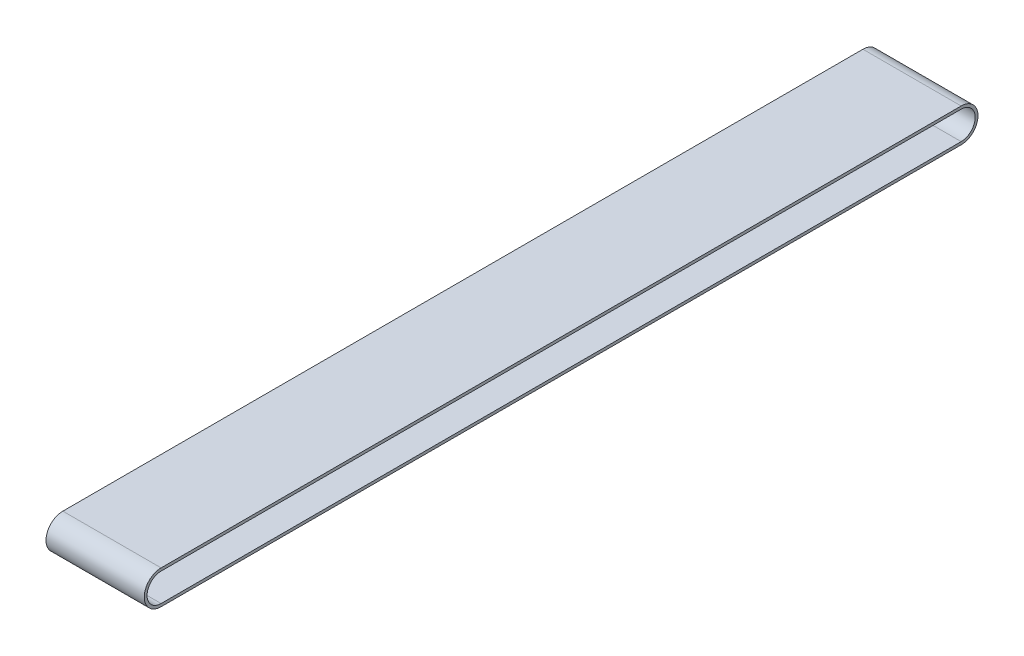
ISO-10303-21;
HEADER;
FILE_DESCRIPTION(('STEP AP214'),'2;1');
FILE_NAME('part.step','',(''),(''),'','','');
FILE_SCHEMA(('AUTOMOTIVE_DESIGN { 1 0 10303 214 1 1 1 1 }'));
ENDSEC;
DATA;
#1=APPLICATION_CONTEXT('core data for automotive mechanical design processes');
#2=APPLICATION_PROTOCOL_DEFINITION('international standard','automotive_design',2000,#1);
#3=PRODUCT_CONTEXT('',#1,'mechanical');
#4=PRODUCT('Part','Part','',(#3));
#5=PRODUCT_RELATED_PRODUCT_CATEGORY('part','',(#4));
#6=PRODUCT_DEFINITION_FORMATION('','',#4);
#7=PRODUCT_DEFINITION_CONTEXT('part definition',#1,'design');
#8=PRODUCT_DEFINITION('design','',#6,#7);
#9=PRODUCT_DEFINITION_SHAPE('','',#8);
#10=(LENGTH_UNIT() NAMED_UNIT(*) SI_UNIT(.MILLI.,.METRE.));
#11=(NAMED_UNIT(*) PLANE_ANGLE_UNIT() SI_UNIT($,.RADIAN.));
#12=(NAMED_UNIT(*) SI_UNIT($,.STERADIAN.) SOLID_ANGLE_UNIT());
#13=UNCERTAINTY_MEASURE_WITH_UNIT(LENGTH_MEASURE(1.E-05),#10,'distance_accuracy_value','');
#14=(GEOMETRIC_REPRESENTATION_CONTEXT(3) GLOBAL_UNCERTAINTY_ASSIGNED_CONTEXT((#13)) GLOBAL_UNIT_ASSIGNED_CONTEXT((#10,
#11,#12)) REPRESENTATION_CONTEXT('',''));
#15=CARTESIAN_POINT('',(0.,0.,0.));
#16=DIRECTION('',(0.,0.,1.));
#17=DIRECTION('',(1.,0.,0.));
#18=AXIS2_PLACEMENT_3D('',#15,#16,#17);
#19=CARTESIAN_POINT('',(350.,0.,0.));
#20=DIRECTION('',(1.,0.,0.));
#21=DIRECTION('',(0.,0.,-1.));
#22=AXIS2_PLACEMENT_3D('',#19,#20,#21);
#23=PLANE('',#22);
#24=CARTESIAN_POINT('',(350.,0.,0.));
#25=DIRECTION('',(1.,0.,0.));
#26=DIRECTION('',(0.,0.,-1.));
#27=AXIS2_PLACEMENT_3D('',#24,#25,#26);
#28=CIRCLE('',#27,59.9999999999998);
#29=CARTESIAN_POINT('',(350.,60.,0.));
#30=VERTEX_POINT('',#29);
#31=CARTESIAN_POINT('',(350.,-59.9999999999996,-3.86409654273834E-13));
#32=VERTEX_POINT('',#31);
#33=EDGE_CURVE('E153',#30,#32,#28,.T.);
#34=ORIENTED_EDGE('',*,*,#33,.T.);
#35=DIRECTION('',(0.,0.,-1.));
#36=VECTOR('',#35,1.);
#37=CARTESIAN_POINT('',(350.,-60.,-2850.));
#38=LINE('',#37,#36);
#39=CARTESIAN_POINT('',(350.,-60.,-2850.));
#40=VERTEX_POINT('',#39);
#41=EDGE_CURVE('E157',#32,#40,#38,.T.);
#42=ORIENTED_EDGE('',*,*,#41,.T.);
#43=CARTESIAN_POINT('',(350.,0.,-2850.));
#44=DIRECTION('',(1.,0.,0.));
#45=DIRECTION('',(0.,0.,-1.));
#46=AXIS2_PLACEMENT_3D('',#43,#44,#45);
#47=CIRCLE('',#46,60.);
#48=CARTESIAN_POINT('',(350.,60.,-2850.));
#49=VERTEX_POINT('',#48);
#50=EDGE_CURVE('E161',#40,#49,#47,.T.);
#51=ORIENTED_EDGE('',*,*,#50,.T.);
#52=DIRECTION('',(0.,0.,1.));
#53=VECTOR('',#52,1.);
#54=CARTESIAN_POINT('',(350.,60.,0.));
#55=LINE('',#54,#53);
#56=EDGE_CURVE('E164',#49,#30,#55,.T.);
#57=ORIENTED_EDGE('',*,*,#56,.T.);
#58=EDGE_LOOP('',(#34,#42,#51,#57));
#59=FACE_BOUND('',#58,.T.);
#60=DIRECTION('',(0.,0.,-1.));
#61=VECTOR('',#60,1.);
#62=CARTESIAN_POINT('',(350.,-49.9999999999998,-2850.));
#63=LINE('',#62,#61);
#64=CARTESIAN_POINT('',(350.,-49.9999999999998,3.5527136788005E-12));
#65=VERTEX_POINT('',#64);
#66=CARTESIAN_POINT('',(350.,-49.9999999999999,-2850.));
#67=VERTEX_POINT('',#66);
#68=EDGE_CURVE('E114',#65,#67,#63,.T.);
#69=ORIENTED_EDGE('',*,*,#68,.F.);
#70=CARTESIAN_POINT('',(350.,0.,0.));
#71=DIRECTION('',(1.,0.,0.));
#72=DIRECTION('',(0.,0.,-1.));
#73=AXIS2_PLACEMENT_3D('',#70,#71,#72);
#74=CIRCLE('',#73,49.9999999999999);
#75=CARTESIAN_POINT('',(350.,50.,0.));
#76=VERTEX_POINT('',#75);
#77=EDGE_CURVE('E105',#76,#65,#74,.T.);
#78=ORIENTED_EDGE('',*,*,#77,.F.);
#79=DIRECTION('',(0.,0.,1.));
#80=VECTOR('',#79,1.);
#81=CARTESIAN_POINT('',(350.,50.,0.));
#82=LINE('',#81,#80);
#83=CARTESIAN_POINT('',(350.,50.,-2850.));
#84=VERTEX_POINT('',#83);
#85=EDGE_CURVE('E131',#84,#76,#82,.T.);
#86=ORIENTED_EDGE('',*,*,#85,.F.);
#87=CARTESIAN_POINT('',(350.,0.,-2850.));
#88=DIRECTION('',(1.,0.,0.));
#89=DIRECTION('',(0.,0.,1.));
#90=AXIS2_PLACEMENT_3D('',#87,#88,#89);
#91=CIRCLE('',#90,49.9999999999999);
#92=EDGE_CURVE('E127',#67,#84,#91,.T.);
#93=ORIENTED_EDGE('',*,*,#92,.F.);
#94=EDGE_LOOP('',(#69,#78,#86,#93));
#95=FACE_BOUND('',#94,.T.);
#96=ADVANCED_FACE('F39',(#59,#95),#23,.T.);
#97=CARTESIAN_POINT('',(0.,0.,0.));
#98=DIRECTION('',(1.,0.,0.));
#99=DIRECTION('',(0.,0.,-1.));
#100=AXIS2_PLACEMENT_3D('',#97,#98,#99);
#101=PLANE('',#100);
#102=CARTESIAN_POINT('',(0.,0.,0.));
#103=DIRECTION('',(1.,0.,0.));
#104=DIRECTION('',(0.,0.,-1.));
#105=AXIS2_PLACEMENT_3D('',#102,#103,#104);
#106=CIRCLE('',#105,59.9999999999998);
#107=CARTESIAN_POINT('',(0.,60.,0.));
#108=VERTEX_POINT('',#107);
#109=CARTESIAN_POINT('',(0.,-59.9999999999996,-3.86409654273834E-13));
#110=VERTEX_POINT('',#109);
#111=EDGE_CURVE('E123',#108,#110,#106,.T.);
#112=ORIENTED_EDGE('',*,*,#111,.F.);
#113=DIRECTION('',(0.,0.,1.));
#114=VECTOR('',#113,1.);
#115=CARTESIAN_POINT('',(0.,60.,0.));
#116=LINE('',#115,#114);
#117=CARTESIAN_POINT('',(0.,60.,-2850.));
#118=VERTEX_POINT('',#117);
#119=EDGE_CURVE('E158',#118,#108,#116,.T.);
#120=ORIENTED_EDGE('',*,*,#119,.F.);
#121=CARTESIAN_POINT('',(0.,0.,-2850.));
#122=DIRECTION('',(1.,0.,0.));
#123=DIRECTION('',(0.,0.,-1.));
#124=AXIS2_PLACEMENT_3D('',#121,#122,#123);
#125=CIRCLE('',#124,60.);
#126=CARTESIAN_POINT('',(0.,-60.,-2850.));
#127=VERTEX_POINT('',#126);
#128=EDGE_CURVE('E174',#127,#118,#125,.T.);
#129=ORIENTED_EDGE('',*,*,#128,.F.);
#130=DIRECTION('',(0.,0.,-1.));
#131=VECTOR('',#130,1.);
#132=CARTESIAN_POINT('',(0.,-60.,-2850.));
#133=LINE('',#132,#131);
#134=EDGE_CURVE('E171',#110,#127,#133,.T.);
#135=ORIENTED_EDGE('',*,*,#134,.F.);
#136=EDGE_LOOP('',(#112,#120,#129,#135));
#137=FACE_BOUND('',#136,.T.);
#138=CARTESIAN_POINT('',(0.,0.,0.));
#139=DIRECTION('',(1.,0.,0.));
#140=DIRECTION('',(0.,0.,-1.));
#141=AXIS2_PLACEMENT_3D('',#138,#139,#140);
#142=CIRCLE('',#141,49.9999999999999);
#143=CARTESIAN_POINT('',(0.,50.,0.));
#144=VERTEX_POINT('',#143);
#145=CARTESIAN_POINT('',(0.,-49.9999999999998,3.5527136788005E-12));
#146=VERTEX_POINT('',#145);
#147=EDGE_CURVE('E63',#144,#146,#142,.T.);
#148=ORIENTED_EDGE('',*,*,#147,.T.);
#149=DIRECTION('',(0.,0.,-1.));
#150=VECTOR('',#149,1.);
#151=CARTESIAN_POINT('',(0.,-49.9999999999998,-2850.));
#152=LINE('',#151,#150);
#153=CARTESIAN_POINT('',(0.,-49.9999999999999,-2850.));
#154=VERTEX_POINT('',#153);
#155=EDGE_CURVE('E121',#146,#154,#152,.T.);
#156=ORIENTED_EDGE('',*,*,#155,.T.);
#157=CARTESIAN_POINT('',(0.,0.,-2850.));
#158=DIRECTION('',(1.,0.,0.));
#159=DIRECTION('',(0.,0.,1.));
#160=AXIS2_PLACEMENT_3D('',#157,#158,#159);
#161=CIRCLE('',#160,49.9999999999999);
#162=CARTESIAN_POINT('',(0.,50.,-2850.));
#163=VERTEX_POINT('',#162);
#164=EDGE_CURVE('E140',#154,#163,#161,.T.);
#165=ORIENTED_EDGE('',*,*,#164,.T.);
#166=DIRECTION('',(0.,0.,1.));
#167=VECTOR('',#166,1.);
#168=CARTESIAN_POINT('',(0.,50.,0.));
#169=LINE('',#168,#167);
#170=EDGE_CURVE('E115',#163,#144,#169,.T.);
#171=ORIENTED_EDGE('',*,*,#170,.T.);
#172=EDGE_LOOP('',(#148,#156,#165,#171));
#173=FACE_BOUND('',#172,.T.);
#174=ADVANCED_FACE('F197',(#137,#173),#101,.F.);
#175=CARTESIAN_POINT('',(350.,0.,0.));
#176=DIRECTION('',(-1.,0.,0.));
#177=DIRECTION('',(0.,0.,1.));
#178=AXIS2_PLACEMENT_3D('',#175,#176,#177);
#179=CYLINDRICAL_SURFACE('',#178,59.9999999999998);
#180=ORIENTED_EDGE('',*,*,#111,.T.);
#181=DIRECTION('',(-1.,0.,0.));
#182=VECTOR('',#181,1.);
#183=CARTESIAN_POINT('',(350.,-59.9999999999996,-3.86409654273834E-13));
#184=LINE('',#183,#182);
#185=EDGE_CURVE('E11',#32,#110,#184,.T.);
#186=ORIENTED_EDGE('',*,*,#185,.F.);
#187=ORIENTED_EDGE('',*,*,#33,.F.);
#188=DIRECTION('',(-1.,0.,0.));
#189=VECTOR('',#188,1.);
#190=CARTESIAN_POINT('',(350.,60.,0.));
#191=LINE('',#190,#189);
#192=EDGE_CURVE('E167',#30,#108,#191,.T.);
#193=ORIENTED_EDGE('',*,*,#192,.T.);
#194=EDGE_LOOP('',(#180,#186,#187,#193));
#195=FACE_BOUND('',#194,.T.);
#196=ADVANCED_FACE('F41',(#195),#179,.T.);
#197=CARTESIAN_POINT('',(350.,-60.,-2850.));
#198=DIRECTION('',(0.,1.,0.));
#199=DIRECTION('',(0.,0.,1.));
#200=AXIS2_PLACEMENT_3D('',#197,#198,#199);
#201=PLANE('',#200);
#202=ORIENTED_EDGE('',*,*,#134,.T.);
#203=DIRECTION('',(-1.,0.,0.));
#204=VECTOR('',#203,1.);
#205=CARTESIAN_POINT('',(350.,-60.,-2850.));
#206=LINE('',#205,#204);
#207=EDGE_CURVE('E48',#40,#127,#206,.T.);
#208=ORIENTED_EDGE('',*,*,#207,.F.);
#209=ORIENTED_EDGE('',*,*,#41,.F.);
#210=ORIENTED_EDGE('',*,*,#185,.T.);
#211=EDGE_LOOP('',(#202,#208,#209,#210));
#212=FACE_BOUND('',#211,.T.);
#213=ADVANCED_FACE('F207',(#212),#201,.F.);
#214=CARTESIAN_POINT('',(350.,0.,-2850.));
#215=DIRECTION('',(-1.,0.,0.));
#216=DIRECTION('',(0.,0.,1.));
#217=AXIS2_PLACEMENT_3D('',#214,#215,#216);
#218=CYLINDRICAL_SURFACE('',#217,60.);
#219=ORIENTED_EDGE('',*,*,#128,.T.);
#220=DIRECTION('',(-1.,0.,0.));
#221=VECTOR('',#220,1.);
#222=CARTESIAN_POINT('',(350.,60.,-2850.));
#223=LINE('',#222,#221);
#224=EDGE_CURVE('E182',#49,#118,#223,.T.);
#225=ORIENTED_EDGE('',*,*,#224,.F.);
#226=ORIENTED_EDGE('',*,*,#50,.F.);
#227=ORIENTED_EDGE('',*,*,#207,.T.);
#228=EDGE_LOOP('',(#219,#225,#226,#227));
#229=FACE_BOUND('',#228,.T.);
#230=ADVANCED_FACE('F191',(#229),#218,.T.);
#231=CARTESIAN_POINT('',(350.,60.,0.));
#232=DIRECTION('',(0.,-1.,0.));
#233=DIRECTION('',(0.,0.,-1.));
#234=AXIS2_PLACEMENT_3D('',#231,#232,#233);
#235=PLANE('',#234);
#236=ORIENTED_EDGE('',*,*,#119,.T.);
#237=ORIENTED_EDGE('',*,*,#192,.F.);
#238=ORIENTED_EDGE('',*,*,#56,.F.);
#239=ORIENTED_EDGE('',*,*,#224,.T.);
#240=EDGE_LOOP('',(#236,#237,#238,#239));
#241=FACE_BOUND('',#240,.T.);
#242=ADVANCED_FACE('F201',(#241),#235,.F.);
#243=CARTESIAN_POINT('',(350.,0.,0.));
#244=DIRECTION('',(-1.,0.,0.));
#245=DIRECTION('',(0.,0.,1.));
#246=AXIS2_PLACEMENT_3D('',#243,#244,#245);
#247=CYLINDRICAL_SURFACE('',#246,49.9999999999999);
#248=ORIENTED_EDGE('',*,*,#147,.F.);
#249=DIRECTION('',(-1.,0.,0.));
#250=VECTOR('',#249,1.);
#251=CARTESIAN_POINT('',(350.,50.,0.));
#252=LINE('',#251,#250);
#253=EDGE_CURVE('E109',#76,#144,#252,.T.);
#254=ORIENTED_EDGE('',*,*,#253,.F.);
#255=ORIENTED_EDGE('',*,*,#77,.T.);
#256=DIRECTION('',(-1.,0.,0.));
#257=VECTOR('',#256,1.);
#258=CARTESIAN_POINT('',(350.,-49.9999999999998,3.5527136788005E-12));
#259=LINE('',#258,#257);
#260=EDGE_CURVE('E108',#65,#146,#259,.T.);
#261=ORIENTED_EDGE('',*,*,#260,.T.);
#262=EDGE_LOOP('',(#248,#254,#255,#261));
#263=FACE_BOUND('',#262,.T.);
#264=ADVANCED_FACE('F107',(#263),#247,.F.);
#265=CARTESIAN_POINT('',(350.,-49.9999999999998,-2850.));
#266=DIRECTION('',(0.,1.,0.));
#267=DIRECTION('',(0.,0.,1.));
#268=AXIS2_PLACEMENT_3D('',#265,#266,#267);
#269=PLANE('',#268);
#270=ORIENTED_EDGE('',*,*,#155,.F.);
#271=ORIENTED_EDGE('',*,*,#260,.F.);
#272=ORIENTED_EDGE('',*,*,#68,.T.);
#273=DIRECTION('',(-1.,0.,0.));
#274=VECTOR('',#273,1.);
#275=CARTESIAN_POINT('',(350.,-49.9999999999999,-2850.));
#276=LINE('',#275,#274);
#277=EDGE_CURVE('E124',#67,#154,#276,.T.);
#278=ORIENTED_EDGE('',*,*,#277,.T.);
#279=EDGE_LOOP('',(#270,#271,#272,#278));
#280=FACE_BOUND('',#279,.T.);
#281=ADVANCED_FACE('F118',(#280),#269,.T.);
#282=CARTESIAN_POINT('',(350.,0.,-2850.));
#283=DIRECTION('',(-1.,0.,0.));
#284=DIRECTION('',(0.,0.,1.));
#285=AXIS2_PLACEMENT_3D('',#282,#283,#284);
#286=CYLINDRICAL_SURFACE('',#285,49.9999999999999);
#287=ORIENTED_EDGE('',*,*,#164,.F.);
#288=ORIENTED_EDGE('',*,*,#277,.F.);
#289=ORIENTED_EDGE('',*,*,#92,.T.);
#290=DIRECTION('',(-1.,0.,0.));
#291=VECTOR('',#290,1.);
#292=CARTESIAN_POINT('',(350.,50.,-2850.));
#293=LINE('',#292,#291);
#294=EDGE_CURVE('E55',#84,#163,#293,.T.);
#295=ORIENTED_EDGE('',*,*,#294,.T.);
#296=EDGE_LOOP('',(#287,#288,#289,#295));
#297=FACE_BOUND('',#296,.T.);
#298=ADVANCED_FACE('F230',(#297),#286,.F.);
#299=CARTESIAN_POINT('',(350.,50.,0.));
#300=DIRECTION('',(0.,-1.,0.));
#301=DIRECTION('',(0.,0.,-1.));
#302=AXIS2_PLACEMENT_3D('',#299,#300,#301);
#303=PLANE('',#302);
#304=ORIENTED_EDGE('',*,*,#170,.F.);
#305=ORIENTED_EDGE('',*,*,#294,.F.);
#306=ORIENTED_EDGE('',*,*,#85,.T.);
#307=ORIENTED_EDGE('',*,*,#253,.T.);
#308=EDGE_LOOP('',(#304,#305,#306,#307));
#309=FACE_BOUND('',#308,.T.);
#310=ADVANCED_FACE('F234',(#309),#303,.T.);
#311=CLOSED_SHELL('',(#96,#174,#196,#213,#230,#242,#264,#281,#298,#310));
#312=MANIFOLD_SOLID_BREP('B2',#311);
#313=ADVANCED_BREP_SHAPE_REPRESENTATION('',(#18,#312),#14);
#314=SHAPE_DEFINITION_REPRESENTATION(#9,#313);
ENDSEC;
END-ISO-10303-21;
